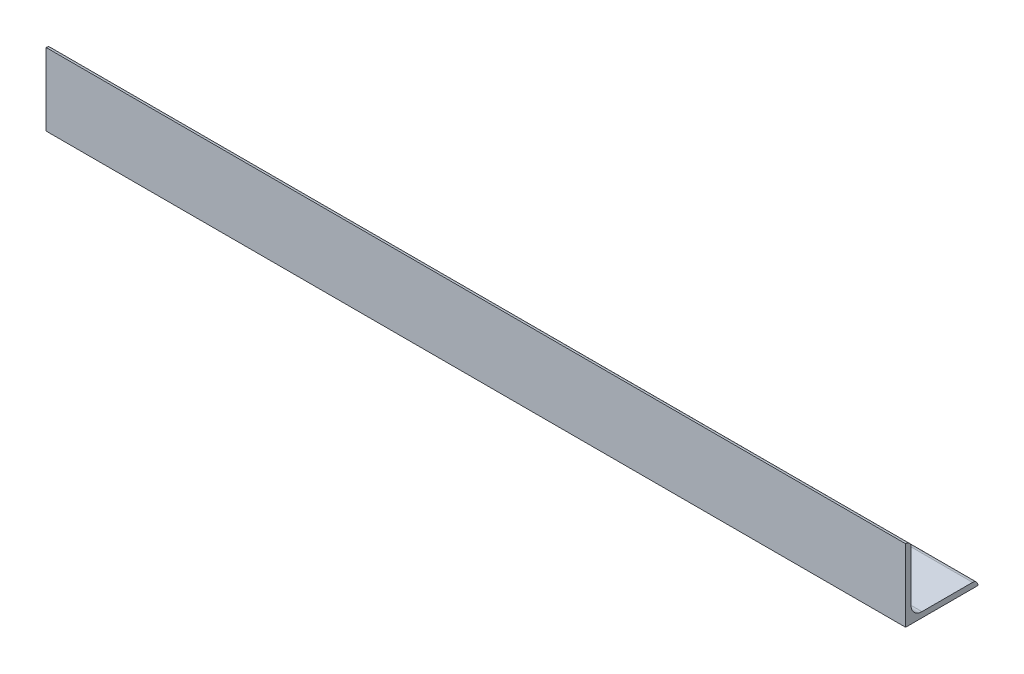
ISO-10303-21;
HEADER;
FILE_DESCRIPTION(('STEP AP214'),'2;1');
FILE_NAME('part.step','',(''),(''),'','','');
FILE_SCHEMA(('AUTOMOTIVE_DESIGN { 1 0 10303 214 1 1 1 1 }'));
ENDSEC;
DATA;
#1=APPLICATION_CONTEXT('core data for automotive mechanical design processes');
#2=APPLICATION_PROTOCOL_DEFINITION('international standard','automotive_design',2000,#1);
#3=PRODUCT_CONTEXT('',#1,'mechanical');
#4=PRODUCT('Part','Part','',(#3));
#5=PRODUCT_RELATED_PRODUCT_CATEGORY('part','',(#4));
#6=PRODUCT_DEFINITION_FORMATION('','',#4);
#7=PRODUCT_DEFINITION_CONTEXT('part definition',#1,'design');
#8=PRODUCT_DEFINITION('design','',#6,#7);
#9=PRODUCT_DEFINITION_SHAPE('','',#8);
#10=(LENGTH_UNIT() NAMED_UNIT(*) SI_UNIT(.MILLI.,.METRE.));
#11=(NAMED_UNIT(*) PLANE_ANGLE_UNIT() SI_UNIT($,.RADIAN.));
#12=(NAMED_UNIT(*) SI_UNIT($,.STERADIAN.) SOLID_ANGLE_UNIT());
#13=UNCERTAINTY_MEASURE_WITH_UNIT(LENGTH_MEASURE(1.E-05),#10,'distance_accuracy_value','');
#14=(GEOMETRIC_REPRESENTATION_CONTEXT(3) GLOBAL_UNCERTAINTY_ASSIGNED_CONTEXT((#13)) GLOBAL_UNIT_ASSIGNED_CONTEXT((#10,
#11,#12)) REPRESENTATION_CONTEXT('',''));
#15=CARTESIAN_POINT('',(0.,0.,0.));
#16=DIRECTION('',(0.,0.,1.));
#17=DIRECTION('',(1.,0.,0.));
#18=AXIS2_PLACEMENT_3D('',#15,#16,#17);
#19=CARTESIAN_POINT('',(475.,0.,-40.));
#20=DIRECTION('',(0.,1.,0.));
#21=DIRECTION('',(0.,0.,1.));
#22=AXIS2_PLACEMENT_3D('',#19,#20,#21);
#23=PLANE('',#22);
#24=DIRECTION('',(0.,0.,-1.));
#25=VECTOR('',#24,1.);
#26=CARTESIAN_POINT('',(0.,0.,-40.));
#27=LINE('',#26,#25);
#28=CARTESIAN_POINT('',(0.,0.,0.));
#29=VERTEX_POINT('',#28);
#30=CARTESIAN_POINT('',(0.,0.,-40.));
#31=VERTEX_POINT('',#30);
#32=EDGE_CURVE('E153',#29,#31,#27,.T.);
#33=ORIENTED_EDGE('',*,*,#32,.T.);
#34=DIRECTION('',(-1.,0.,0.));
#35=VECTOR('',#34,1.);
#36=CARTESIAN_POINT('',(475.,0.,-40.));
#37=LINE('',#36,#35);
#38=CARTESIAN_POINT('',(475.,0.,-40.));
#39=VERTEX_POINT('',#38);
#40=EDGE_CURVE('E13',#39,#31,#37,.T.);
#41=ORIENTED_EDGE('',*,*,#40,.F.);
#42=DIRECTION('',(0.,0.,-1.));
#43=VECTOR('',#42,1.);
#44=CARTESIAN_POINT('',(475.,0.,-40.));
#45=LINE('',#44,#43);
#46=CARTESIAN_POINT('',(475.,0.,0.));
#47=VERTEX_POINT('',#46);
#48=EDGE_CURVE('E165',#47,#39,#45,.T.);
#49=ORIENTED_EDGE('',*,*,#48,.F.);
#50=DIRECTION('',(-1.,0.,0.));
#51=VECTOR('',#50,1.);
#52=CARTESIAN_POINT('',(475.,0.,0.));
#53=LINE('',#52,#51);
#54=EDGE_CURVE('E149',#47,#29,#53,.T.);
#55=ORIENTED_EDGE('',*,*,#54,.T.);
#56=EDGE_LOOP('',(#33,#41,#49,#55));
#57=FACE_BOUND('',#56,.T.);
#58=ADVANCED_FACE('F63',(#57),#23,.F.);
#59=CARTESIAN_POINT('',(475.,0.,-37.));
#60=DIRECTION('',(-1.,0.,0.));
#61=DIRECTION('',(0.,0.,1.));
#62=AXIS2_PLACEMENT_3D('',#59,#60,#61);
#63=CYLINDRICAL_SURFACE('',#62,3.);
#64=CARTESIAN_POINT('',(0.,0.,-37.));
#65=DIRECTION('',(1.,0.,0.));
#66=DIRECTION('',(0.,0.,-1.));
#67=AXIS2_PLACEMENT_3D('',#64,#65,#66);
#68=CIRCLE('',#67,3.);
#69=CARTESIAN_POINT('',(0.,3.,-37.));
#70=VERTEX_POINT('',#69);
#71=EDGE_CURVE('E156',#31,#70,#68,.T.);
#72=ORIENTED_EDGE('',*,*,#71,.T.);
#73=DIRECTION('',(-1.,0.,0.));
#74=VECTOR('',#73,1.);
#75=CARTESIAN_POINT('',(475.,3.,-37.));
#76=LINE('',#75,#74);
#77=CARTESIAN_POINT('',(475.,3.,-37.));
#78=VERTEX_POINT('',#77);
#79=EDGE_CURVE('E71',#78,#70,#76,.T.);
#80=ORIENTED_EDGE('',*,*,#79,.F.);
#81=CARTESIAN_POINT('',(475.,0.,-37.));
#82=DIRECTION('',(1.,0.,0.));
#83=DIRECTION('',(0.,0.,-1.));
#84=AXIS2_PLACEMENT_3D('',#81,#82,#83);
#85=CIRCLE('',#84,3.);
#86=EDGE_CURVE('E119',#39,#78,#85,.T.);
#87=ORIENTED_EDGE('',*,*,#86,.F.);
#88=ORIENTED_EDGE('',*,*,#40,.T.);
#89=EDGE_LOOP('',(#72,#80,#87,#88));
#90=FACE_BOUND('',#89,.T.);
#91=ADVANCED_FACE('F190',(#90),#63,.T.);
#92=CARTESIAN_POINT('',(475.,3.,-9.));
#93=DIRECTION('',(0.,-1.,0.));
#94=DIRECTION('',(0.,0.,-1.));
#95=AXIS2_PLACEMENT_3D('',#92,#93,#94);
#96=PLANE('',#95);
#97=DIRECTION('',(0.,0.,1.));
#98=VECTOR('',#97,1.);
#99=CARTESIAN_POINT('',(0.,3.,-9.));
#100=LINE('',#99,#98);
#101=CARTESIAN_POINT('',(0.,3.,-9.00000000000001));
#102=VERTEX_POINT('',#101);
#103=EDGE_CURVE('E158',#70,#102,#100,.T.);
#104=ORIENTED_EDGE('',*,*,#103,.T.);
#105=DIRECTION('',(-1.,0.,0.));
#106=VECTOR('',#105,1.);
#107=CARTESIAN_POINT('',(475.,3.,-9.00000000000001));
#108=LINE('',#107,#106);
#109=CARTESIAN_POINT('',(475.,3.,-9.00000000000001));
#110=VERTEX_POINT('',#109);
#111=EDGE_CURVE('E169',#110,#102,#108,.T.);
#112=ORIENTED_EDGE('',*,*,#111,.F.);
#113=DIRECTION('',(0.,0.,1.));
#114=VECTOR('',#113,1.);
#115=CARTESIAN_POINT('',(475.,3.,-9.));
#116=LINE('',#115,#114);
#117=EDGE_CURVE('E177',#78,#110,#116,.T.);
#118=ORIENTED_EDGE('',*,*,#117,.F.);
#119=ORIENTED_EDGE('',*,*,#79,.T.);
#120=EDGE_LOOP('',(#104,#112,#118,#119));
#121=FACE_BOUND('',#120,.T.);
#122=ADVANCED_FACE('F175',(#121),#96,.F.);
#123=CARTESIAN_POINT('',(475.,9.,-9.));
#124=DIRECTION('',(-1.,0.,0.));
#125=DIRECTION('',(0.,0.,1.));
#126=AXIS2_PLACEMENT_3D('',#123,#124,#125);
#127=CYLINDRICAL_SURFACE('',#126,6.);
#128=CARTESIAN_POINT('',(0.,9.,-9.));
#129=DIRECTION('',(-1.,0.,0.));
#130=DIRECTION('',(0.,0.,1.));
#131=AXIS2_PLACEMENT_3D('',#128,#129,#130);
#132=CIRCLE('',#131,6.);
#133=CARTESIAN_POINT('',(0.,9.,-3.));
#134=VERTEX_POINT('',#133);
#135=EDGE_CURVE('E160',#102,#134,#132,.T.);
#136=ORIENTED_EDGE('',*,*,#135,.T.);
#137=DIRECTION('',(-1.,0.,0.));
#138=VECTOR('',#137,1.);
#139=CARTESIAN_POINT('',(475.,9.,-3.));
#140=LINE('',#139,#138);
#141=CARTESIAN_POINT('',(475.,9.,-3.));
#142=VERTEX_POINT('',#141);
#143=EDGE_CURVE('E144',#142,#134,#140,.T.);
#144=ORIENTED_EDGE('',*,*,#143,.F.);
#145=CARTESIAN_POINT('',(475.,9.,-9.));
#146=DIRECTION('',(-1.,0.,0.));
#147=DIRECTION('',(0.,0.,1.));
#148=AXIS2_PLACEMENT_3D('',#145,#146,#147);
#149=CIRCLE('',#148,6.);
#150=EDGE_CURVE('E135',#110,#142,#149,.T.);
#151=ORIENTED_EDGE('',*,*,#150,.F.);
#152=ORIENTED_EDGE('',*,*,#111,.T.);
#153=EDGE_LOOP('',(#136,#144,#151,#152));
#154=FACE_BOUND('',#153,.T.);
#155=ADVANCED_FACE('F183',(#154),#127,.F.);
#156=CARTESIAN_POINT('',(475.,37.,-3.));
#157=DIRECTION('',(0.,0.,1.));
#158=DIRECTION('',(1.,0.,0.));
#159=AXIS2_PLACEMENT_3D('',#156,#157,#158);
#160=PLANE('',#159);
#161=DIRECTION('',(0.,1.,0.));
#162=VECTOR('',#161,1.);
#163=CARTESIAN_POINT('',(0.,37.,-3.));
#164=LINE('',#163,#162);
#165=CARTESIAN_POINT('',(0.,37.,-3.));
#166=VERTEX_POINT('',#165);
#167=EDGE_CURVE('E143',#134,#166,#164,.T.);
#168=ORIENTED_EDGE('',*,*,#167,.T.);
#169=DIRECTION('',(-1.,0.,0.));
#170=VECTOR('',#169,1.);
#171=CARTESIAN_POINT('',(475.,37.,-3.));
#172=LINE('',#171,#170);
#173=CARTESIAN_POINT('',(475.,37.,-3.));
#174=VERTEX_POINT('',#173);
#175=EDGE_CURVE('E140',#174,#166,#172,.T.);
#176=ORIENTED_EDGE('',*,*,#175,.F.);
#177=DIRECTION('',(0.,1.,0.));
#178=VECTOR('',#177,1.);
#179=CARTESIAN_POINT('',(475.,37.,-3.));
#180=LINE('',#179,#178);
#181=EDGE_CURVE('E129',#142,#174,#180,.T.);
#182=ORIENTED_EDGE('',*,*,#181,.F.);
#183=ORIENTED_EDGE('',*,*,#143,.T.);
#184=EDGE_LOOP('',(#168,#176,#182,#183));
#185=FACE_BOUND('',#184,.T.);
#186=ADVANCED_FACE('F141',(#185),#160,.F.);
#187=CARTESIAN_POINT('',(475.,37.,0.));
#188=DIRECTION('',(-1.,0.,0.));
#189=DIRECTION('',(0.,0.,1.));
#190=AXIS2_PLACEMENT_3D('',#187,#188,#189);
#191=CYLINDRICAL_SURFACE('',#190,3.);
#192=CARTESIAN_POINT('',(0.,37.,0.));
#193=DIRECTION('',(1.,0.,0.));
#194=DIRECTION('',(0.,0.,-1.));
#195=AXIS2_PLACEMENT_3D('',#192,#193,#194);
#196=CIRCLE('',#195,3.);
#197=CARTESIAN_POINT('',(0.,40.,0.));
#198=VERTEX_POINT('',#197);
#199=EDGE_CURVE('E105',#166,#198,#196,.T.);
#200=ORIENTED_EDGE('',*,*,#199,.T.);
#201=DIRECTION('',(-1.,0.,0.));
#202=VECTOR('',#201,1.);
#203=CARTESIAN_POINT('',(475.,40.,0.));
#204=LINE('',#203,#202);
#205=CARTESIAN_POINT('',(475.,40.,0.));
#206=VERTEX_POINT('',#205);
#207=EDGE_CURVE('E145',#206,#198,#204,.T.);
#208=ORIENTED_EDGE('',*,*,#207,.F.);
#209=CARTESIAN_POINT('',(475.,37.,0.));
#210=DIRECTION('',(1.,0.,0.));
#211=DIRECTION('',(0.,0.,-1.));
#212=AXIS2_PLACEMENT_3D('',#209,#210,#211);
#213=CIRCLE('',#212,3.);
#214=EDGE_CURVE('E133',#174,#206,#213,.T.);
#215=ORIENTED_EDGE('',*,*,#214,.F.);
#216=ORIENTED_EDGE('',*,*,#175,.T.);
#217=EDGE_LOOP('',(#200,#208,#215,#216));
#218=FACE_BOUND('',#217,.T.);
#219=ADVANCED_FACE('F147',(#218),#191,.T.);
#220=CARTESIAN_POINT('',(475.,40.,0.));
#221=DIRECTION('',(0.,0.,-1.));
#222=DIRECTION('',(-1.,0.,0.));
#223=AXIS2_PLACEMENT_3D('',#220,#221,#222);
#224=PLANE('',#223);
#225=DIRECTION('',(0.,-1.,0.));
#226=VECTOR('',#225,1.);
#227=CARTESIAN_POINT('',(0.,40.,0.));
#228=LINE('',#227,#226);
#229=EDGE_CURVE('E111',#198,#29,#228,.T.);
#230=ORIENTED_EDGE('',*,*,#229,.T.);
#231=ORIENTED_EDGE('',*,*,#54,.F.);
#232=DIRECTION('',(0.,-1.,0.));
#233=VECTOR('',#232,1.);
#234=CARTESIAN_POINT('',(475.,40.,0.));
#235=LINE('',#234,#233);
#236=EDGE_CURVE('E79',#206,#47,#235,.T.);
#237=ORIENTED_EDGE('',*,*,#236,.F.);
#238=ORIENTED_EDGE('',*,*,#207,.T.);
#239=EDGE_LOOP('',(#230,#231,#237,#238));
#240=FACE_BOUND('',#239,.T.);
#241=ADVANCED_FACE('F204',(#240),#224,.F.);
#242=CARTESIAN_POINT('',(475.,37.,0.));
#243=DIRECTION('',(1.,0.,0.));
#244=DIRECTION('',(0.,0.,-1.));
#245=AXIS2_PLACEMENT_3D('',#242,#243,#244);
#246=PLANE('',#245);
#247=ORIENTED_EDGE('',*,*,#48,.T.);
#248=ORIENTED_EDGE('',*,*,#86,.T.);
#249=ORIENTED_EDGE('',*,*,#117,.T.);
#250=ORIENTED_EDGE('',*,*,#150,.T.);
#251=ORIENTED_EDGE('',*,*,#181,.T.);
#252=ORIENTED_EDGE('',*,*,#214,.T.);
#253=ORIENTED_EDGE('',*,*,#236,.T.);
#254=EDGE_LOOP('',(#247,#248,#249,#250,#251,#252,#253));
#255=FACE_BOUND('',#254,.T.);
#256=ADVANCED_FACE('F131',(#255),#246,.T.);
#257=CARTESIAN_POINT('',(0.,37.,0.));
#258=DIRECTION('',(1.,0.,0.));
#259=DIRECTION('',(0.,0.,-1.));
#260=AXIS2_PLACEMENT_3D('',#257,#258,#259);
#261=PLANE('',#260);
#262=ORIENTED_EDGE('',*,*,#32,.F.);
#263=ORIENTED_EDGE('',*,*,#229,.F.);
#264=ORIENTED_EDGE('',*,*,#199,.F.);
#265=ORIENTED_EDGE('',*,*,#167,.F.);
#266=ORIENTED_EDGE('',*,*,#135,.F.);
#267=ORIENTED_EDGE('',*,*,#103,.F.);
#268=ORIENTED_EDGE('',*,*,#71,.F.);
#269=EDGE_LOOP('',(#262,#263,#264,#265,#266,#267,#268));
#270=FACE_BOUND('',#269,.T.);
#271=ADVANCED_FACE('F181',(#270),#261,.F.);
#272=CLOSED_SHELL('',(#58,#91,#122,#155,#186,#219,#241,#256,#271));
#273=MANIFOLD_SOLID_BREP('B2',#272);
#274=ADVANCED_BREP_SHAPE_REPRESENTATION('',(#18,#273),#14);
#275=SHAPE_DEFINITION_REPRESENTATION(#9,#274);
ENDSEC;
END-ISO-10303-21;
